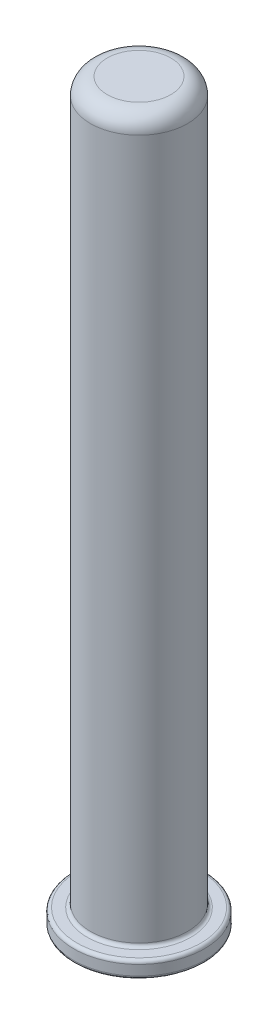
ISO-10303-21;
HEADER;
FILE_DESCRIPTION(('STEP AP214'),'2;1');
FILE_NAME('part.step','',(''),(''),'','','');
FILE_SCHEMA(('AUTOMOTIVE_DESIGN { 1 0 10303 214 1 1 1 1 }'));
ENDSEC;
DATA;
#1=APPLICATION_CONTEXT('core data for automotive mechanical design processes');
#2=APPLICATION_PROTOCOL_DEFINITION('international standard','automotive_design',2000,#1);
#3=PRODUCT_CONTEXT('',#1,'mechanical');
#4=PRODUCT('Part','Part','',(#3));
#5=PRODUCT_RELATED_PRODUCT_CATEGORY('part','',(#4));
#6=PRODUCT_DEFINITION_FORMATION('','',#4);
#7=PRODUCT_DEFINITION_CONTEXT('part definition',#1,'design');
#8=PRODUCT_DEFINITION('design','',#6,#7);
#9=PRODUCT_DEFINITION_SHAPE('','',#8);
#10=(LENGTH_UNIT() NAMED_UNIT(*) SI_UNIT(.MILLI.,.METRE.));
#11=(NAMED_UNIT(*) PLANE_ANGLE_UNIT() SI_UNIT($,.RADIAN.));
#12=(NAMED_UNIT(*) SI_UNIT($,.STERADIAN.) SOLID_ANGLE_UNIT());
#13=UNCERTAINTY_MEASURE_WITH_UNIT(LENGTH_MEASURE(1.E-05),#10,'distance_accuracy_value','');
#14=(GEOMETRIC_REPRESENTATION_CONTEXT(3) GLOBAL_UNCERTAINTY_ASSIGNED_CONTEXT((#13)) GLOBAL_UNIT_ASSIGNED_CONTEXT((#10,
#11,#12)) REPRESENTATION_CONTEXT('',''));
#15=CARTESIAN_POINT('',(0.,0.,0.));
#16=DIRECTION('',(0.,0.,1.));
#17=DIRECTION('',(1.,0.,0.));
#18=AXIS2_PLACEMENT_3D('',#15,#16,#17);
#19=CARTESIAN_POINT('',(0.,220.,0.));
#20=DIRECTION('',(0.,-1.,0.));
#21=DIRECTION('',(0.,0.,-1.));
#22=AXIS2_PLACEMENT_3D('',#19,#20,#21);
#23=CYLINDRICAL_SURFACE('',#22,14.5);
#24=CARTESIAN_POINT('',(0.,6.00000000000001,0.));
#25=DIRECTION('',(0.,-1.,0.));
#26=DIRECTION('',(0.,0.,-1.));
#27=AXIS2_PLACEMENT_3D('',#24,#25,#26);
#28=CIRCLE('',#27,14.5);
#29=CARTESIAN_POINT('',(0.,6.00000000000001,-14.5));
#30=VERTEX_POINT('',#29);
#31=EDGE_CURVE('E10',#30,#30,#28,.F.);
#32=ORIENTED_EDGE('',*,*,#31,.T.);
#33=EDGE_LOOP('',(#32));
#34=FACE_BOUND('',#33,.T.);
#35=CARTESIAN_POINT('',(0.,215.,0.));
#36=DIRECTION('',(0.,1.,0.));
#37=DIRECTION('',(0.,0.,1.));
#38=AXIS2_PLACEMENT_3D('',#35,#36,#37);
#39=CIRCLE('',#38,14.5);
#40=CARTESIAN_POINT('',(0.,215.,14.5));
#41=VERTEX_POINT('',#40);
#42=EDGE_CURVE('E73',#41,#41,#39,.F.);
#43=ORIENTED_EDGE('',*,*,#42,.T.);
#44=EDGE_LOOP('',(#43));
#45=FACE_BOUND('',#44,.T.);
#46=ADVANCED_FACE('F41',(#34,#45),#23,.T.);
#47=CARTESIAN_POINT('',(0.,220.,0.));
#48=DIRECTION('',(0.,1.,0.));
#49=DIRECTION('',(0.,0.,1.));
#50=AXIS2_PLACEMENT_3D('',#47,#48,#49);
#51=PLANE('',#50);
#52=CARTESIAN_POINT('',(0.,220.,0.));
#53=DIRECTION('',(0.,1.,0.));
#54=DIRECTION('',(0.,0.,1.));
#55=AXIS2_PLACEMENT_3D('',#52,#53,#54);
#56=CIRCLE('',#55,9.5);
#57=CARTESIAN_POINT('',(0.,220.,9.5));
#58=VERTEX_POINT('',#57);
#59=EDGE_CURVE('E77',#58,#58,#56,.T.);
#60=ORIENTED_EDGE('',*,*,#59,.T.);
#61=EDGE_LOOP('',(#60));
#62=FACE_BOUND('',#61,.T.);
#63=ADVANCED_FACE('F82',(#62),#51,.T.);
#64=CARTESIAN_POINT('',(0.,215.,0.));
#65=DIRECTION('',(0.,1.,0.));
#66=DIRECTION('',(0.,0.,1.));
#67=AXIS2_PLACEMENT_3D('',#64,#65,#66);
#68=TOROIDAL_SURFACE('',#67,9.5,5.);
#69=ORIENTED_EDGE('',*,*,#42,.F.);
#70=EDGE_LOOP('',(#69));
#71=FACE_BOUND('',#70,.T.);
#72=ORIENTED_EDGE('',*,*,#59,.F.);
#73=EDGE_LOOP('',(#72));
#74=FACE_BOUND('',#73,.T.);
#75=ADVANCED_FACE('F84',(#71,#74),#68,.T.);
#76=CARTESIAN_POINT('',(0.,5.,0.));
#77=DIRECTION('',(0.,-1.,0.));
#78=DIRECTION('',(0.,0.,-1.));
#79=AXIS2_PLACEMENT_3D('',#76,#77,#78);
#80=CYLINDRICAL_SURFACE('',#79,19.5);
#81=CARTESIAN_POINT('',(0.,1.,0.));
#82=DIRECTION('',(0.,1.,0.));
#83=DIRECTION('',(0.,0.,1.));
#84=AXIS2_PLACEMENT_3D('',#81,#82,#83);
#85=CIRCLE('',#84,19.5);
#86=CARTESIAN_POINT('',(0.,1.,19.5));
#87=VERTEX_POINT('',#86);
#88=EDGE_CURVE('E59',#87,#87,#85,.T.);
#89=ORIENTED_EDGE('',*,*,#88,.T.);
#90=EDGE_LOOP('',(#89));
#91=FACE_BOUND('',#90,.T.);
#92=CARTESIAN_POINT('',(0.,4.,0.));
#93=DIRECTION('',(0.,-1.,0.));
#94=DIRECTION('',(0.,0.,-1.));
#95=AXIS2_PLACEMENT_3D('',#92,#93,#94);
#96=CIRCLE('',#95,19.5);
#97=CARTESIAN_POINT('',(0.,4.,-19.5));
#98=VERTEX_POINT('',#97);
#99=EDGE_CURVE('E65',#98,#98,#96,.T.);
#100=ORIENTED_EDGE('',*,*,#99,.T.);
#101=EDGE_LOOP('',(#100));
#102=FACE_BOUND('',#101,.T.);
#103=ADVANCED_FACE('F86',(#91,#102),#80,.T.);
#104=CARTESIAN_POINT('',(0.,5.,0.));
#105=DIRECTION('',(0.,-1.,0.));
#106=DIRECTION('',(0.,0.,-1.));
#107=AXIS2_PLACEMENT_3D('',#104,#105,#106);
#108=PLANE('',#107);
#109=CARTESIAN_POINT('',(0.,5.,0.));
#110=DIRECTION('',(0.,-1.,0.));
#111=DIRECTION('',(0.,0.,-1.));
#112=AXIS2_PLACEMENT_3D('',#109,#110,#111);
#113=CIRCLE('',#112,15.5);
#114=CARTESIAN_POINT('',(0.,5.,-15.5));
#115=VERTEX_POINT('',#114);
#116=EDGE_CURVE('E49',#115,#115,#113,.T.);
#117=ORIENTED_EDGE('',*,*,#116,.T.);
#118=EDGE_LOOP('',(#117));
#119=FACE_BOUND('',#118,.T.);
#120=CARTESIAN_POINT('',(0.,5.,0.));
#121=DIRECTION('',(0.,-1.,0.));
#122=DIRECTION('',(0.,0.,-1.));
#123=AXIS2_PLACEMENT_3D('',#120,#121,#122);
#124=CIRCLE('',#123,18.5);
#125=CARTESIAN_POINT('',(0.,5.,-18.5));
#126=VERTEX_POINT('',#125);
#127=EDGE_CURVE('E54',#126,#126,#124,.F.);
#128=ORIENTED_EDGE('',*,*,#127,.T.);
#129=EDGE_LOOP('',(#128));
#130=FACE_BOUND('',#129,.T.);
#131=ADVANCED_FACE('F93',(#119,#130),#108,.F.);
#132=CARTESIAN_POINT('',(0.,0.,0.));
#133=DIRECTION('',(0.,1.,0.));
#134=DIRECTION('',(0.,0.,1.));
#135=AXIS2_PLACEMENT_3D('',#132,#133,#134);
#136=PLANE('',#135);
#137=CARTESIAN_POINT('',(0.,0.,0.));
#138=DIRECTION('',(0.,1.,0.));
#139=DIRECTION('',(0.,0.,1.));
#140=AXIS2_PLACEMENT_3D('',#137,#138,#139);
#141=CIRCLE('',#140,18.5);
#142=CARTESIAN_POINT('',(0.,0.,18.5));
#143=VERTEX_POINT('',#142);
#144=EDGE_CURVE('E69',#143,#143,#141,.F.);
#145=ORIENTED_EDGE('',*,*,#144,.T.);
#146=EDGE_LOOP('',(#145));
#147=FACE_BOUND('',#146,.T.);
#148=ADVANCED_FACE('F105',(#147),#136,.F.);
#149=CARTESIAN_POINT('',(0.,1.,0.));
#150=DIRECTION('',(0.,1.,0.));
#151=DIRECTION('',(0.,0.,1.));
#152=AXIS2_PLACEMENT_3D('',#149,#150,#151);
#153=TOROIDAL_SURFACE('',#152,18.5,1.);
#154=ORIENTED_EDGE('',*,*,#88,.F.);
#155=EDGE_LOOP('',(#154));
#156=FACE_BOUND('',#155,.T.);
#157=ORIENTED_EDGE('',*,*,#144,.F.);
#158=EDGE_LOOP('',(#157));
#159=FACE_BOUND('',#158,.T.);
#160=ADVANCED_FACE('F107',(#156,#159),#153,.T.);
#161=CARTESIAN_POINT('',(0.,6.00000000000001,0.));
#162=DIRECTION('',(0.,-1.,0.));
#163=DIRECTION('',(0.,0.,-1.));
#164=AXIS2_PLACEMENT_3D('',#161,#162,#163);
#165=TOROIDAL_SURFACE('',#164,15.5,1.);
#166=ORIENTED_EDGE('',*,*,#31,.F.);
#167=EDGE_LOOP('',(#166));
#168=FACE_BOUND('',#167,.T.);
#169=ORIENTED_EDGE('',*,*,#116,.F.);
#170=EDGE_LOOP('',(#169));
#171=FACE_BOUND('',#170,.T.);
#172=ADVANCED_FACE('F118',(#168,#171),#165,.F.);
#173=CARTESIAN_POINT('',(0.,4.,0.));
#174=DIRECTION('',(0.,-1.,0.));
#175=DIRECTION('',(0.,0.,-1.));
#176=AXIS2_PLACEMENT_3D('',#173,#174,#175);
#177=TOROIDAL_SURFACE('',#176,18.5,1.);
#178=ORIENTED_EDGE('',*,*,#127,.F.);
#179=EDGE_LOOP('',(#178));
#180=FACE_BOUND('',#179,.T.);
#181=ORIENTED_EDGE('',*,*,#99,.F.);
#182=EDGE_LOOP('',(#181));
#183=FACE_BOUND('',#182,.T.);
#184=ADVANCED_FACE('F43',(#180,#183),#177,.T.);
#185=CLOSED_SHELL('',(#46,#63,#75,#103,#131,#148,#160,#172,#184));
#186=MANIFOLD_SOLID_BREP('B2',#185);
#187=ADVANCED_BREP_SHAPE_REPRESENTATION('',(#18,#186),#14);
#188=SHAPE_DEFINITION_REPRESENTATION(#9,#187);
ENDSEC;
END-ISO-10303-21;
